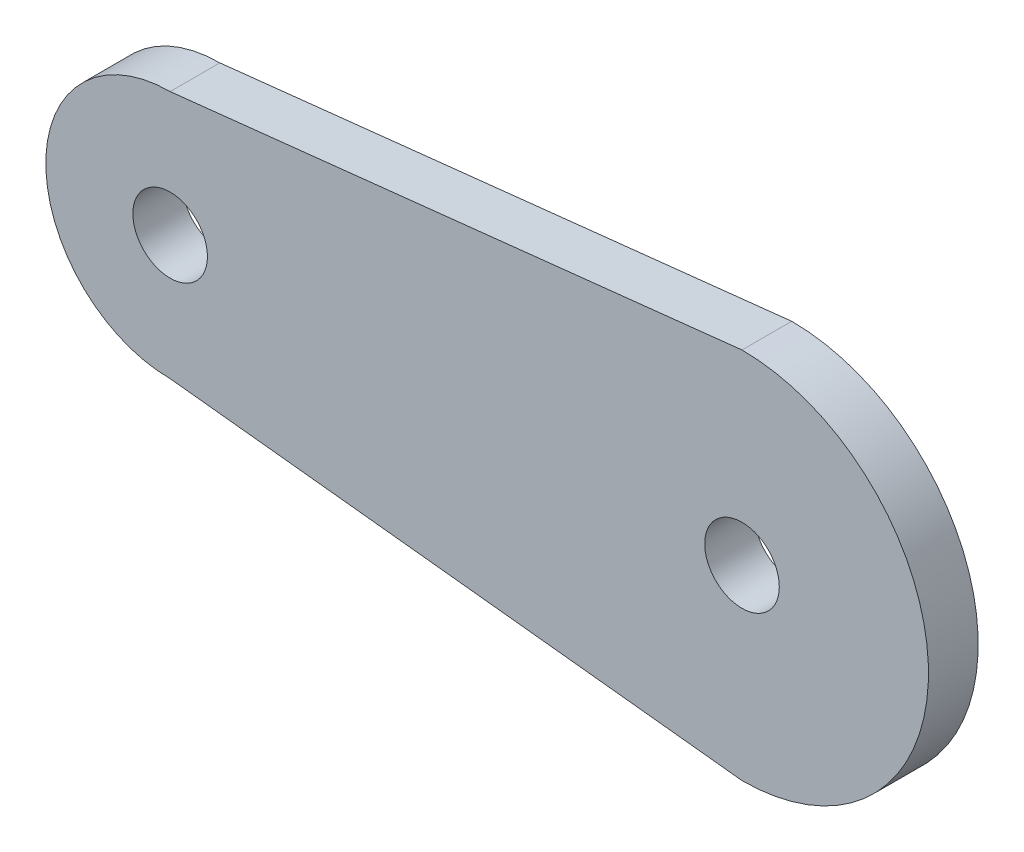
ISO-10303-21;
HEADER;
FILE_DESCRIPTION(('STEP AP214'),'2;1');
FILE_NAME('part.step','',(''),(''),'','','');
FILE_SCHEMA(('AUTOMOTIVE_DESIGN { 1 0 10303 214 1 1 1 1 }'));
ENDSEC;
DATA;
#1=APPLICATION_CONTEXT('core data for automotive mechanical design processes');
#2=APPLICATION_PROTOCOL_DEFINITION('international standard','automotive_design',2000,#1);
#3=PRODUCT_CONTEXT('',#1,'mechanical');
#4=PRODUCT('Part','Part','',(#3));
#5=PRODUCT_RELATED_PRODUCT_CATEGORY('part','',(#4));
#6=PRODUCT_DEFINITION_FORMATION('','',#4);
#7=PRODUCT_DEFINITION_CONTEXT('part definition',#1,'design');
#8=PRODUCT_DEFINITION('design','',#6,#7);
#9=PRODUCT_DEFINITION_SHAPE('','',#8);
#10=(LENGTH_UNIT() NAMED_UNIT(*) SI_UNIT(.MILLI.,.METRE.));
#11=(NAMED_UNIT(*) PLANE_ANGLE_UNIT() SI_UNIT($,.RADIAN.));
#12=(NAMED_UNIT(*) SI_UNIT($,.STERADIAN.) SOLID_ANGLE_UNIT());
#13=UNCERTAINTY_MEASURE_WITH_UNIT(LENGTH_MEASURE(1.E-05),#10,'distance_accuracy_value','');
#14=(GEOMETRIC_REPRESENTATION_CONTEXT(3) GLOBAL_UNCERTAINTY_ASSIGNED_CONTEXT((#13)) GLOBAL_UNIT_ASSIGNED_CONTEXT((#10,
#11,#12)) REPRESENTATION_CONTEXT('',''));
#15=CARTESIAN_POINT('',(0.,0.,0.));
#16=DIRECTION('',(0.,0.,1.));
#17=DIRECTION('',(1.,0.,0.));
#18=AXIS2_PLACEMENT_3D('',#15,#16,#17);
#19=CARTESIAN_POINT('',(23.,0.,16.));
#20=DIRECTION('',(0.,0.,-1.));
#21=DIRECTION('',(-1.,0.,0.));
#22=AXIS2_PLACEMENT_3D('',#19,#20,#21);
#23=CYLINDRICAL_SURFACE('',#22,7.5);
#24=CARTESIAN_POINT('',(23.,0.,14.));
#25=DIRECTION('',(0.,0.,1.));
#26=DIRECTION('',(1.,0.,0.));
#27=AXIS2_PLACEMENT_3D('',#24,#25,#26);
#28=CIRCLE('',#27,7.5);
#29=CARTESIAN_POINT('',(23.,7.5,14.));
#30=VERTEX_POINT('',#29);
#31=CARTESIAN_POINT('',(23.,-7.5,14.));
#32=VERTEX_POINT('',#31);
#33=EDGE_CURVE('E76',#30,#32,#28,.F.);
#34=ORIENTED_EDGE('',*,*,#33,.F.);
#35=DIRECTION('',(0.,0.,-1.));
#36=VECTOR('',#35,1.);
#37=CARTESIAN_POINT('',(23.,7.5,16.));
#38=LINE('',#37,#36);
#39=CARTESIAN_POINT('',(23.,7.5,16.));
#40=VERTEX_POINT('',#39);
#41=EDGE_CURVE('E100',#40,#30,#38,.T.);
#42=ORIENTED_EDGE('',*,*,#41,.F.);
#43=CARTESIAN_POINT('',(23.,0.,16.));
#44=DIRECTION('',(0.,0.,1.));
#45=DIRECTION('',(1.,0.,0.));
#46=AXIS2_PLACEMENT_3D('',#43,#44,#45);
#47=CIRCLE('',#46,7.5);
#48=CARTESIAN_POINT('',(23.,-7.5,16.));
#49=VERTEX_POINT('',#48);
#50=EDGE_CURVE('E97',#40,#49,#47,.F.);
#51=ORIENTED_EDGE('',*,*,#50,.T.);
#52=DIRECTION('',(0.,0.,-1.));
#53=VECTOR('',#52,1.);
#54=CARTESIAN_POINT('',(23.,-7.5,16.));
#55=LINE('',#54,#53);
#56=EDGE_CURVE('E43',#49,#32,#55,.T.);
#57=ORIENTED_EDGE('',*,*,#56,.T.);
#58=EDGE_LOOP('',(#34,#42,#51,#57));
#59=FACE_BOUND('',#58,.T.);
#60=ADVANCED_FACE('F39',(#59),#23,.T.);
#61=CARTESIAN_POINT('',(-0.537132181223727,4.94161606725829,16.));
#62=DIRECTION('',(-0.108059180768419,0.994144463069457,0.));
#63=DIRECTION('',(-0.994144463069457,-0.108059180768419,0.));
#64=AXIS2_PLACEMENT_3D('',#61,#62,#63);
#65=PLANE('',#64);
#66=DIRECTION('',(0.994144463069457,0.108059180768419,0.));
#67=VECTOR('',#66,1.);
#68=CARTESIAN_POINT('',(-0.537132181223728,4.94161606725829,14.));
#69=LINE('',#68,#67);
#70=CARTESIAN_POINT('',(0.,5.,14.));
#71=VERTEX_POINT('',#70);
#72=EDGE_CURVE('E48',#71,#30,#69,.T.);
#73=ORIENTED_EDGE('',*,*,#72,.F.);
#74=DIRECTION('',(0.,0.,-1.));
#75=VECTOR('',#74,1.);
#76=CARTESIAN_POINT('',(0.,5.,16.));
#77=LINE('',#76,#75);
#78=CARTESIAN_POINT('',(0.,5.,16.));
#79=VERTEX_POINT('',#78);
#80=EDGE_CURVE('E110',#79,#71,#77,.T.);
#81=ORIENTED_EDGE('',*,*,#80,.F.);
#82=DIRECTION('',(0.994144463069457,0.108059180768419,0.));
#83=VECTOR('',#82,1.);
#84=CARTESIAN_POINT('',(-0.537132181223727,4.94161606725829,16.));
#85=LINE('',#84,#83);
#86=EDGE_CURVE('E98',#79,#40,#85,.T.);
#87=ORIENTED_EDGE('',*,*,#86,.T.);
#88=ORIENTED_EDGE('',*,*,#41,.T.);
#89=EDGE_LOOP('',(#73,#81,#87,#88));
#90=FACE_BOUND('',#89,.T.);
#91=ADVANCED_FACE('F140',(#90),#65,.T.);
#92=CARTESIAN_POINT('',(0.,0.,16.));
#93=DIRECTION('',(0.,0.,-1.));
#94=DIRECTION('',(-1.,0.,0.));
#95=AXIS2_PLACEMENT_3D('',#92,#93,#94);
#96=CYLINDRICAL_SURFACE('',#95,5.);
#97=ORIENTED_EDGE('',*,*,#80,.T.);
#98=CARTESIAN_POINT('',(0.,0.,14.));
#99=DIRECTION('',(0.,0.,1.));
#100=DIRECTION('',(1.,0.,0.));
#101=AXIS2_PLACEMENT_3D('',#98,#99,#100);
#102=CIRCLE('',#101,5.);
#103=CARTESIAN_POINT('',(0.,-5.,14.));
#104=VERTEX_POINT('',#103);
#105=EDGE_CURVE('E61',#71,#104,#102,.T.);
#106=ORIENTED_EDGE('',*,*,#105,.T.);
#107=DIRECTION('',(0.,0.,-1.));
#108=VECTOR('',#107,1.);
#109=CARTESIAN_POINT('',(0.,-5.,16.));
#110=LINE('',#109,#108);
#111=CARTESIAN_POINT('',(0.,-5.,16.));
#112=VERTEX_POINT('',#111);
#113=EDGE_CURVE('E93',#112,#104,#110,.T.);
#114=ORIENTED_EDGE('',*,*,#113,.F.);
#115=CARTESIAN_POINT('',(0.,0.,16.));
#116=DIRECTION('',(0.,0.,1.));
#117=DIRECTION('',(1.,0.,0.));
#118=AXIS2_PLACEMENT_3D('',#115,#116,#117);
#119=CIRCLE('',#118,5.);
#120=EDGE_CURVE('E120',#79,#112,#119,.T.);
#121=ORIENTED_EDGE('',*,*,#120,.F.);
#122=EDGE_LOOP('',(#97,#106,#114,#121));
#123=FACE_BOUND('',#122,.T.);
#124=ADVANCED_FACE('F144',(#123),#96,.T.);
#125=CARTESIAN_POINT('',(23.,0.,16.));
#126=DIRECTION('',(0.,0.,-1.));
#127=DIRECTION('',(-1.,0.,0.));
#128=AXIS2_PLACEMENT_3D('',#125,#126,#127);
#129=CYLINDRICAL_SURFACE('',#128,1.5);
#130=CARTESIAN_POINT('',(23.,0.,14.));
#131=DIRECTION('',(0.,0.,1.));
#132=DIRECTION('',(1.,0.,0.));
#133=AXIS2_PLACEMENT_3D('',#130,#131,#132);
#134=CIRCLE('',#133,1.5);
#135=CARTESIAN_POINT('',(24.5,0.,14.));
#136=VERTEX_POINT('',#135);
#137=EDGE_CURVE('E84',#136,#136,#134,.T.);
#138=ORIENTED_EDGE('',*,*,#137,.F.);
#139=EDGE_LOOP('',(#138));
#140=FACE_BOUND('',#139,.T.);
#141=CARTESIAN_POINT('',(23.,0.,16.));
#142=DIRECTION('',(0.,0.,1.));
#143=DIRECTION('',(1.,0.,0.));
#144=AXIS2_PLACEMENT_3D('',#141,#142,#143);
#145=CIRCLE('',#144,1.5);
#146=CARTESIAN_POINT('',(24.5,0.,16.));
#147=VERTEX_POINT('',#146);
#148=EDGE_CURVE('E109',#147,#147,#145,.T.);
#149=ORIENTED_EDGE('',*,*,#148,.T.);
#150=EDGE_LOOP('',(#149));
#151=FACE_BOUND('',#150,.T.);
#152=ADVANCED_FACE('F150',(#140,#151),#129,.F.);
#153=CARTESIAN_POINT('',(-0.537132181223727,-4.94161606725829,16.));
#154=DIRECTION('',(0.108059180768419,0.994144463069457,0.));
#155=DIRECTION('',(-0.994144463069457,0.108059180768419,0.));
#156=AXIS2_PLACEMENT_3D('',#153,#154,#155);
#157=PLANE('',#156);
#158=ORIENTED_EDGE('',*,*,#113,.T.);
#159=DIRECTION('',(0.994144463069457,-0.108059180768419,0.));
#160=VECTOR('',#159,1.);
#161=CARTESIAN_POINT('',(-0.537132181223728,-4.94161606725829,14.));
#162=LINE('',#161,#160);
#163=EDGE_CURVE('E80',#104,#32,#162,.T.);
#164=ORIENTED_EDGE('',*,*,#163,.T.);
#165=ORIENTED_EDGE('',*,*,#56,.F.);
#166=DIRECTION('',(0.994144463069457,-0.108059180768419,0.));
#167=VECTOR('',#166,1.);
#168=CARTESIAN_POINT('',(-0.537132181223727,-4.94161606725829,16.));
#169=LINE('',#168,#167);
#170=EDGE_CURVE('E106',#112,#49,#169,.T.);
#171=ORIENTED_EDGE('',*,*,#170,.F.);
#172=EDGE_LOOP('',(#158,#164,#165,#171));
#173=FACE_BOUND('',#172,.T.);
#174=ADVANCED_FACE('F89',(#173),#157,.F.);
#175=CARTESIAN_POINT('',(0.,0.,16.));
#176=DIRECTION('',(0.,0.,-1.));
#177=DIRECTION('',(-1.,0.,0.));
#178=AXIS2_PLACEMENT_3D('',#175,#176,#177);
#179=CYLINDRICAL_SURFACE('',#178,1.5);
#180=CARTESIAN_POINT('',(0.,0.,14.));
#181=DIRECTION('',(0.,0.,1.));
#182=DIRECTION('',(1.,0.,0.));
#183=AXIS2_PLACEMENT_3D('',#180,#181,#182);
#184=CIRCLE('',#183,1.5);
#185=CARTESIAN_POINT('',(1.5,0.,14.));
#186=VERTEX_POINT('',#185);
#187=EDGE_CURVE('E11',#186,#186,#184,.T.);
#188=ORIENTED_EDGE('',*,*,#187,.F.);
#189=EDGE_LOOP('',(#188));
#190=FACE_BOUND('',#189,.T.);
#191=CARTESIAN_POINT('',(0.,0.,16.));
#192=DIRECTION('',(0.,0.,1.));
#193=DIRECTION('',(1.,0.,0.));
#194=AXIS2_PLACEMENT_3D('',#191,#192,#193);
#195=CIRCLE('',#194,1.5);
#196=CARTESIAN_POINT('',(1.5,0.,16.));
#197=VERTEX_POINT('',#196);
#198=EDGE_CURVE('E94',#197,#197,#195,.T.);
#199=ORIENTED_EDGE('',*,*,#198,.T.);
#200=EDGE_LOOP('',(#199));
#201=FACE_BOUND('',#200,.T.);
#202=ADVANCED_FACE('F41',(#190,#201),#179,.F.);
#203=CARTESIAN_POINT('',(0.,0.,16.));
#204=DIRECTION('',(0.,0.,1.));
#205=DIRECTION('',(1.,0.,0.));
#206=AXIS2_PLACEMENT_3D('',#203,#204,#205);
#207=PLANE('',#206);
#208=ORIENTED_EDGE('',*,*,#50,.F.);
#209=ORIENTED_EDGE('',*,*,#86,.F.);
#210=ORIENTED_EDGE('',*,*,#120,.T.);
#211=ORIENTED_EDGE('',*,*,#170,.T.);
#212=EDGE_LOOP('',(#208,#209,#210,#211));
#213=FACE_BOUND('',#212,.T.);
#214=ORIENTED_EDGE('',*,*,#148,.F.);
#215=EDGE_LOOP('',(#214));
#216=FACE_BOUND('',#215,.T.);
#217=ORIENTED_EDGE('',*,*,#198,.F.);
#218=EDGE_LOOP('',(#217));
#219=FACE_BOUND('',#218,.T.);
#220=ADVANCED_FACE('F128',(#213,#216,#219),#207,.T.);
#221=CARTESIAN_POINT('',(41.5858435918892,-7.5,14.));
#222=DIRECTION('',(0.,0.,1.));
#223=DIRECTION('',(1.,0.,0.));
#224=AXIS2_PLACEMENT_3D('',#221,#222,#223);
#225=PLANE('',#224);
#226=ORIENTED_EDGE('',*,*,#137,.T.);
#227=EDGE_LOOP('',(#226));
#228=FACE_BOUND('',#227,.T.);
#229=ORIENTED_EDGE('',*,*,#33,.T.);
#230=ORIENTED_EDGE('',*,*,#163,.F.);
#231=ORIENTED_EDGE('',*,*,#105,.F.);
#232=ORIENTED_EDGE('',*,*,#72,.T.);
#233=EDGE_LOOP('',(#229,#230,#231,#232));
#234=FACE_BOUND('',#233,.T.);
#235=ORIENTED_EDGE('',*,*,#187,.T.);
#236=EDGE_LOOP('',(#235));
#237=FACE_BOUND('',#236,.T.);
#238=ADVANCED_FACE('F78',(#228,#234,#237),#225,.F.);
#239=CLOSED_SHELL('',(#60,#91,#124,#152,#174,#202,#220,#238));
#240=MANIFOLD_SOLID_BREP('B2',#239);
#241=ADVANCED_BREP_SHAPE_REPRESENTATION('',(#18,#240),#14);
#242=SHAPE_DEFINITION_REPRESENTATION(#9,#241);
ENDSEC;
END-ISO-10303-21;
